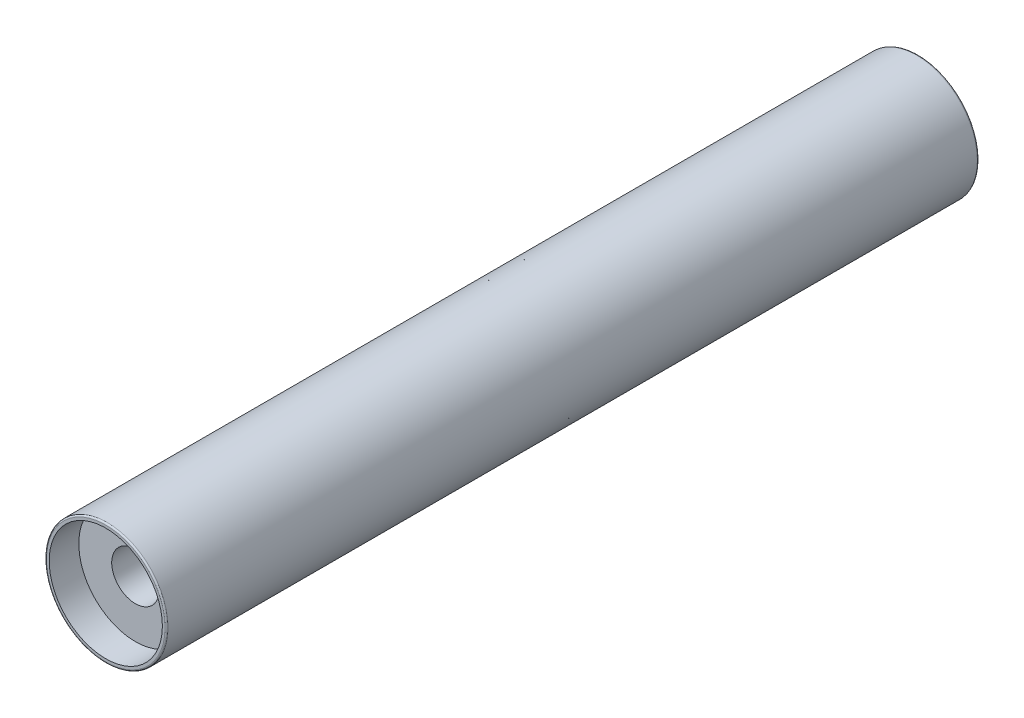
ISO-10303-21;
HEADER;
FILE_DESCRIPTION(('STEP AP214'),'2;1');
FILE_NAME('part.step','',(''),(''),'','','');
FILE_SCHEMA(('AUTOMOTIVE_DESIGN { 1 0 10303 214 1 1 1 1 }'));
ENDSEC;
DATA;
#1=APPLICATION_CONTEXT('core data for automotive mechanical design processes');
#2=APPLICATION_PROTOCOL_DEFINITION('international standard','automotive_design',2000,#1);
#3=PRODUCT_CONTEXT('',#1,'mechanical');
#4=PRODUCT('Part','Part','',(#3));
#5=PRODUCT_RELATED_PRODUCT_CATEGORY('part','',(#4));
#6=PRODUCT_DEFINITION_FORMATION('','',#4);
#7=PRODUCT_DEFINITION_CONTEXT('part definition',#1,'design');
#8=PRODUCT_DEFINITION('design','',#6,#7);
#9=PRODUCT_DEFINITION_SHAPE('','',#8);
#10=(LENGTH_UNIT() NAMED_UNIT(*) SI_UNIT(.MILLI.,.METRE.));
#11=(NAMED_UNIT(*) PLANE_ANGLE_UNIT() SI_UNIT($,.RADIAN.));
#12=(NAMED_UNIT(*) SI_UNIT($,.STERADIAN.) SOLID_ANGLE_UNIT());
#13=UNCERTAINTY_MEASURE_WITH_UNIT(LENGTH_MEASURE(1.E-05),#10,'distance_accuracy_value','');
#14=(GEOMETRIC_REPRESENTATION_CONTEXT(3) GLOBAL_UNCERTAINTY_ASSIGNED_CONTEXT((#13)) GLOBAL_UNIT_ASSIGNED_CONTEXT((#10,
#11,#12)) REPRESENTATION_CONTEXT('',''));
#15=CARTESIAN_POINT('',(0.,0.,0.));
#16=DIRECTION('',(0.,0.,1.));
#17=DIRECTION('',(1.,0.,0.));
#18=AXIS2_PLACEMENT_3D('',#15,#16,#17);
#19=CARTESIAN_POINT('',(0.,0.,-63.5191));
#20=DIRECTION('',(0.,0.,-1.));
#21=DIRECTION('',(0.,-1.,0.));
#22=AXIS2_PLACEMENT_3D('',#19,#20,#21);
#23=PLANE('',#22);
#24=CARTESIAN_POINT('',(0.,0.,-63.5191));
#25=DIRECTION('',(0.,0.,1.));
#26=DIRECTION('',(-1.,0.,0.));
#27=AXIS2_PLACEMENT_3D('',#24,#25,#26);
#28=CIRCLE('',#27,4.);
#29=CARTESIAN_POINT('',(4.,0.,-63.5191));
#30=VERTEX_POINT('',#29);
#31=EDGE_CURVE('E27',#30,#30,#28,.T.);
#32=ORIENTED_EDGE('',*,*,#31,.T.);
#33=EDGE_LOOP('',(#32));
#34=FACE_BOUND('',#33,.T.);
#35=CARTESIAN_POINT('',(0.,0.,-63.5191));
#36=DIRECTION('',(0.,0.,1.));
#37=DIRECTION('',(1.,0.,0.));
#38=AXIS2_PLACEMENT_3D('',#35,#36,#37);
#39=CIRCLE('',#38,9.55);
#40=CARTESIAN_POINT('',(9.55,0.,-63.5191));
#41=VERTEX_POINT('',#40);
#42=EDGE_CURVE('E116',#41,#41,#39,.T.);
#43=ORIENTED_EDGE('',*,*,#42,.F.);
#44=EDGE_LOOP('',(#43));
#45=FACE_BOUND('',#44,.T.);
#46=ADVANCED_FACE('F17',(#34,#45),#23,.T.);
#47=CARTESIAN_POINT('',(0.,0.,63.5191));
#48=DIRECTION('',(0.,0.,1.));
#49=DIRECTION('',(1.,0.,0.));
#50=AXIS2_PLACEMENT_3D('',#47,#48,#49);
#51=PLANE('',#50);
#52=CARTESIAN_POINT('',(0.,0.,63.5191));
#53=DIRECTION('',(0.,0.,-1.));
#54=DIRECTION('',(1.,0.,0.));
#55=AXIS2_PLACEMENT_3D('',#52,#53,#54);
#56=CIRCLE('',#55,4.);
#57=CARTESIAN_POINT('',(4.,0.,63.5191));
#58=VERTEX_POINT('',#57);
#59=EDGE_CURVE('E20',#58,#58,#56,.T.);
#60=ORIENTED_EDGE('',*,*,#59,.T.);
#61=EDGE_LOOP('',(#60));
#62=FACE_BOUND('',#61,.T.);
#63=CARTESIAN_POINT('',(0.,0.,63.5191));
#64=DIRECTION('',(0.,0.,1.));
#65=DIRECTION('',(1.,0.,0.));
#66=AXIS2_PLACEMENT_3D('',#63,#64,#65);
#67=CIRCLE('',#66,9.55);
#68=CARTESIAN_POINT('',(9.55,0.,63.5191));
#69=VERTEX_POINT('',#68);
#70=EDGE_CURVE('E105',#69,#69,#67,.T.);
#71=ORIENTED_EDGE('',*,*,#70,.T.);
#72=EDGE_LOOP('',(#71));
#73=FACE_BOUND('',#72,.T.);
#74=ADVANCED_FACE('F156',(#62,#73),#51,.T.);
#75=CARTESIAN_POINT('',(0.,0.,-68.5191));
#76=DIRECTION('',(0.,0.,1.));
#77=DIRECTION('',(1.,0.,0.));
#78=AXIS2_PLACEMENT_3D('',#75,#76,#77);
#79=PLANE('',#78);
#80=CARTESIAN_POINT('',(0.,0.,-68.5191));
#81=DIRECTION('',(0.,0.,1.));
#82=DIRECTION('',(1.,0.,0.));
#83=AXIS2_PLACEMENT_3D('',#80,#81,#82);
#84=CIRCLE('',#83,9.55);
#85=CARTESIAN_POINT('',(-9.55,0.,-68.5191));
#86=VERTEX_POINT('',#85);
#87=EDGE_CURVE('E113',#86,#86,#84,.T.);
#88=ORIENTED_EDGE('',*,*,#87,.T.);
#89=EDGE_LOOP('',(#88));
#90=FACE_BOUND('',#89,.T.);
#91=CARTESIAN_POINT('',(0.,0.,-68.5191));
#92=DIRECTION('',(0.,0.,-1.));
#93=DIRECTION('',(1.,0.,0.));
#94=AXIS2_PLACEMENT_3D('',#91,#92,#93);
#95=CIRCLE('',#94,10.);
#96=CARTESIAN_POINT('',(10.,0.,-68.5191));
#97=VERTEX_POINT('',#96);
#98=EDGE_CURVE('E93',#97,#97,#95,.T.);
#99=ORIENTED_EDGE('',*,*,#98,.T.);
#100=EDGE_LOOP('',(#99));
#101=FACE_BOUND('',#100,.T.);
#102=ADVANCED_FACE('F162',(#90,#101),#79,.F.);
#103=CARTESIAN_POINT('',(0.,0.,68.5191));
#104=DIRECTION('',(0.,0.,1.));
#105=DIRECTION('',(1.,0.,0.));
#106=AXIS2_PLACEMENT_3D('',#103,#104,#105);
#107=PLANE('',#106);
#108=CARTESIAN_POINT('',(0.,0.,68.5191));
#109=DIRECTION('',(0.,0.,1.));
#110=DIRECTION('',(1.,0.,0.));
#111=AXIS2_PLACEMENT_3D('',#108,#109,#110);
#112=CIRCLE('',#111,9.55);
#113=CARTESIAN_POINT('',(9.55,0.,68.5191));
#114=VERTEX_POINT('',#113);
#115=EDGE_CURVE('E100',#114,#114,#112,.T.);
#116=ORIENTED_EDGE('',*,*,#115,.F.);
#117=EDGE_LOOP('',(#116));
#118=FACE_BOUND('',#117,.T.);
#119=CARTESIAN_POINT('',(0.,0.,68.5191));
#120=DIRECTION('',(0.,0.,1.));
#121=DIRECTION('',(1.,0.,0.));
#122=AXIS2_PLACEMENT_3D('',#119,#120,#121);
#123=CIRCLE('',#122,10.);
#124=CARTESIAN_POINT('',(10.,0.,68.5191));
#125=VERTEX_POINT('',#124);
#126=EDGE_CURVE('E125',#125,#125,#123,.T.);
#127=ORIENTED_EDGE('',*,*,#126,.T.);
#128=EDGE_LOOP('',(#127));
#129=FACE_BOUND('',#128,.T.);
#130=ADVANCED_FACE('F191',(#118,#129),#107,.T.);
#131=CARTESIAN_POINT('',(0.,0.,-53.3));
#132=DIRECTION('',(0.,0.,1.));
#133=DIRECTION('',(1.,0.,0.));
#134=AXIS2_PLACEMENT_3D('',#131,#132,#133);
#135=PLANE('',#134);
#136=CARTESIAN_POINT('',(0.,0.,-53.3));
#137=DIRECTION('',(0.,0.,1.));
#138=DIRECTION('',(1.,0.,0.));
#139=AXIS2_PLACEMENT_3D('',#136,#137,#138);
#140=CIRCLE('',#139,4.);
#141=CARTESIAN_POINT('',(4.,0.,-53.3));
#142=VERTEX_POINT('',#141);
#143=EDGE_CURVE('E11',#142,#142,#140,.T.);
#144=ORIENTED_EDGE('',*,*,#143,.F.);
#145=EDGE_LOOP('',(#144));
#146=FACE_BOUND('',#145,.T.);
#147=CARTESIAN_POINT('',(0.,0.,-53.3));
#148=DIRECTION('',(0.,0.,-1.));
#149=DIRECTION('',(1.,0.,0.));
#150=AXIS2_PLACEMENT_3D('',#147,#148,#149);
#151=CIRCLE('',#150,9.525);
#152=CARTESIAN_POINT('',(-9.525,0.,-53.3));
#153=VERTEX_POINT('',#152);
#154=EDGE_CURVE('E121',#153,#153,#151,.T.);
#155=ORIENTED_EDGE('',*,*,#154,.F.);
#156=EDGE_LOOP('',(#155));
#157=FACE_BOUND('',#156,.T.);
#158=ADVANCED_FACE('F179',(#146,#157),#135,.T.);
#159=CARTESIAN_POINT('',(0.,0.,53.3));
#160=DIRECTION('',(0.,0.,1.));
#161=DIRECTION('',(1.,0.,0.));
#162=AXIS2_PLACEMENT_3D('',#159,#160,#161);
#163=PLANE('',#162);
#164=CARTESIAN_POINT('',(0.,0.,53.3));
#165=DIRECTION('',(0.,0.,1.));
#166=DIRECTION('',(1.,0.,0.));
#167=AXIS2_PLACEMENT_3D('',#164,#165,#166);
#168=CIRCLE('',#167,4.);
#169=CARTESIAN_POINT('',(4.,0.,53.3));
#170=VERTEX_POINT('',#169);
#171=EDGE_CURVE('E118',#170,#170,#168,.T.);
#172=ORIENTED_EDGE('',*,*,#171,.T.);
#173=EDGE_LOOP('',(#172));
#174=FACE_BOUND('',#173,.T.);
#175=CARTESIAN_POINT('',(0.,0.,53.3));
#176=DIRECTION('',(0.,0.,1.));
#177=DIRECTION('',(1.,0.,0.));
#178=AXIS2_PLACEMENT_3D('',#175,#176,#177);
#179=CIRCLE('',#178,9.525);
#180=CARTESIAN_POINT('',(9.525,0.,53.3));
#181=VERTEX_POINT('',#180);
#182=EDGE_CURVE('E123',#181,#181,#179,.T.);
#183=ORIENTED_EDGE('',*,*,#182,.F.);
#184=EDGE_LOOP('',(#183));
#185=FACE_BOUND('',#184,.T.);
#186=ADVANCED_FACE('F170',(#174,#185),#163,.F.);
#187=CARTESIAN_POINT('',(0.,0.,-68.5191));
#188=DIRECTION('',(0.,0.,1.));
#189=DIRECTION('',(1.,0.,0.));
#190=AXIS2_PLACEMENT_3D('',#187,#188,#189);
#191=CYLINDRICAL_SURFACE('',#190,4.);
#192=ORIENTED_EDGE('',*,*,#143,.T.);
#193=EDGE_LOOP('',(#192));
#194=FACE_BOUND('',#193,.T.);
#195=ORIENTED_EDGE('',*,*,#31,.F.);
#196=EDGE_LOOP('',(#195));
#197=FACE_BOUND('',#196,.T.);
#198=ADVANCED_FACE('F167',(#194,#197),#191,.F.);
#199=CARTESIAN_POINT('',(0.,0.,-68.5191));
#200=DIRECTION('',(0.,0.,1.));
#201=DIRECTION('',(1.,0.,0.));
#202=AXIS2_PLACEMENT_3D('',#199,#200,#201);
#203=CYLINDRICAL_SURFACE('',#202,4.);
#204=ORIENTED_EDGE('',*,*,#59,.F.);
#205=EDGE_LOOP('',(#204));
#206=FACE_BOUND('',#205,.T.);
#207=ORIENTED_EDGE('',*,*,#171,.F.);
#208=EDGE_LOOP('',(#207));
#209=FACE_BOUND('',#208,.T.);
#210=ADVANCED_FACE('F169',(#206,#209),#203,.F.);
#211=CARTESIAN_POINT('',(0.,0.,80.2407683632075));
#212=DIRECTION('',(0.,0.,-1.));
#213=DIRECTION('',(-1.,0.,0.));
#214=AXIS2_PLACEMENT_3D('',#211,#212,#213);
#215=CYLINDRICAL_SURFACE('',#214,9.525);
#216=ORIENTED_EDGE('',*,*,#154,.T.);
#217=EDGE_LOOP('',(#216));
#218=FACE_BOUND('',#217,.T.);
#219=ORIENTED_EDGE('',*,*,#182,.T.);
#220=EDGE_LOOP('',(#219));
#221=FACE_BOUND('',#220,.T.);
#222=ADVANCED_FACE('F176',(#218,#221),#215,.F.);
#223=CARTESIAN_POINT('',(0.,0.,97.5104780286484));
#224=DIRECTION('',(0.,0.,-1.));
#225=DIRECTION('',(-1.,0.,0.));
#226=AXIS2_PLACEMENT_3D('',#223,#224,#225);
#227=CYLINDRICAL_SURFACE('',#226,10.25);
#228=CARTESIAN_POINT('',(0.,0.,-68.2691));
#229=DIRECTION('',(0.,0.,1.));
#230=DIRECTION('',(1.,0.,0.));
#231=AXIS2_PLACEMENT_3D('',#228,#229,#230);
#232=CIRCLE('',#231,10.25);
#233=CARTESIAN_POINT('',(10.25,0.,-68.2691));
#234=VERTEX_POINT('',#233);
#235=EDGE_CURVE('E85',#234,#234,#232,.T.);
#236=ORIENTED_EDGE('',*,*,#235,.T.);
#237=EDGE_LOOP('',(#236));
#238=FACE_BOUND('',#237,.T.);
#239=CARTESIAN_POINT('',(0.,0.,68.2691));
#240=DIRECTION('',(0.,0.,-1.));
#241=DIRECTION('',(1.,0.,0.));
#242=AXIS2_PLACEMENT_3D('',#239,#240,#241);
#243=CIRCLE('',#242,10.25);
#244=CARTESIAN_POINT('',(10.25,0.,68.2691));
#245=VERTEX_POINT('',#244);
#246=EDGE_CURVE('E134',#245,#245,#243,.T.);
#247=ORIENTED_EDGE('',*,*,#246,.T.);
#248=EDGE_LOOP('',(#247));
#249=FACE_BOUND('',#248,.T.);
#250=ADVANCED_FACE('F201',(#238,#249),#227,.T.);
#251=CARTESIAN_POINT('',(0.,0.,68.2691));
#252=DIRECTION('',(0.,0.,1.));
#253=DIRECTION('',(1.,0.,0.));
#254=AXIS2_PLACEMENT_3D('',#251,#252,#253);
#255=TOROIDAL_SURFACE('',#254,10.,0.25);
#256=ORIENTED_EDGE('',*,*,#126,.F.);
#257=EDGE_LOOP('',(#256));
#258=FACE_BOUND('',#257,.T.);
#259=ORIENTED_EDGE('',*,*,#246,.F.);
#260=EDGE_LOOP('',(#259));
#261=FACE_BOUND('',#260,.T.);
#262=ADVANCED_FACE('F188',(#258,#261),#255,.T.);
#263=CARTESIAN_POINT('',(0.,0.,-68.2691));
#264=DIRECTION('',(0.,0.,1.));
#265=DIRECTION('',(1.,0.,0.));
#266=AXIS2_PLACEMENT_3D('',#263,#264,#265);
#267=TOROIDAL_SURFACE('',#266,10.,0.25);
#268=ORIENTED_EDGE('',*,*,#235,.F.);
#269=EDGE_LOOP('',(#268));
#270=FACE_BOUND('',#269,.T.);
#271=ORIENTED_EDGE('',*,*,#98,.F.);
#272=EDGE_LOOP('',(#271));
#273=FACE_BOUND('',#272,.T.);
#274=ADVANCED_FACE('F186',(#270,#273),#267,.T.);
#275=CARTESIAN_POINT('',(0.,0.,63.5191));
#276=DIRECTION('',(0.,0.,1.));
#277=DIRECTION('',(1.,0.,0.));
#278=AXIS2_PLACEMENT_3D('',#275,#276,#277);
#279=CYLINDRICAL_SURFACE('',#278,9.55);
#280=ORIENTED_EDGE('',*,*,#115,.T.);
#281=EDGE_LOOP('',(#280));
#282=FACE_BOUND('',#281,.T.);
#283=ORIENTED_EDGE('',*,*,#70,.F.);
#284=EDGE_LOOP('',(#283));
#285=FACE_BOUND('',#284,.T.);
#286=ADVANCED_FACE('F101',(#282,#285),#279,.F.);
#287=CARTESIAN_POINT('',(0.,0.,-63.5191));
#288=DIRECTION('',(0.,0.,-1.));
#289=DIRECTION('',(-1.,0.,0.));
#290=AXIS2_PLACEMENT_3D('',#287,#288,#289);
#291=CYLINDRICAL_SURFACE('',#290,9.55);
#292=ORIENTED_EDGE('',*,*,#87,.F.);
#293=EDGE_LOOP('',(#292));
#294=FACE_BOUND('',#293,.T.);
#295=ORIENTED_EDGE('',*,*,#42,.T.);
#296=EDGE_LOOP('',(#295));
#297=FACE_BOUND('',#296,.T.);
#298=ADVANCED_FACE('F153',(#294,#297),#291,.F.);
#299=CLOSED_SHELL('',(#46,#74,#102,#130,#158,#186,#198,#210,#222,#250,#262,#274,#286,#298));
#300=MANIFOLD_SOLID_BREP('B1',#299);
#301=ADVANCED_BREP_SHAPE_REPRESENTATION('',(#18,#300),#14);
#302=SHAPE_DEFINITION_REPRESENTATION(#9,#301);
ENDSEC;
END-ISO-10303-21;
